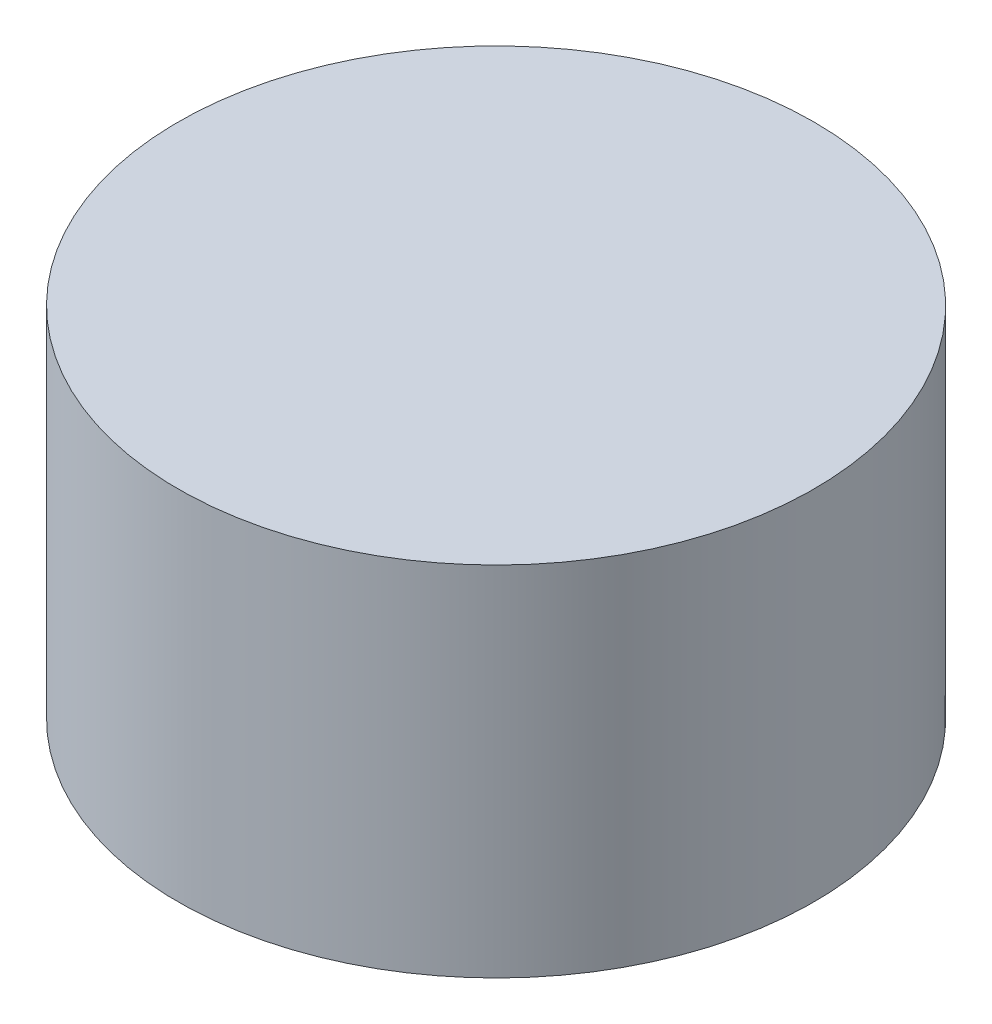
ISO-10303-21;
HEADER;
FILE_DESCRIPTION(('STEP AP214'),'2;1');
FILE_NAME('part.step','',(''),(''),'','','');
FILE_SCHEMA(('AUTOMOTIVE_DESIGN { 1 0 10303 214 1 1 1 1 }'));
ENDSEC;
DATA;
#1=APPLICATION_CONTEXT('core data for automotive mechanical design processes');
#2=APPLICATION_PROTOCOL_DEFINITION('international standard','automotive_design',2000,#1);
#3=PRODUCT_CONTEXT('',#1,'mechanical');
#4=PRODUCT('Part','Part','',(#3));
#5=PRODUCT_RELATED_PRODUCT_CATEGORY('part','',(#4));
#6=PRODUCT_DEFINITION_FORMATION('','',#4);
#7=PRODUCT_DEFINITION_CONTEXT('part definition',#1,'design');
#8=PRODUCT_DEFINITION('design','',#6,#7);
#9=PRODUCT_DEFINITION_SHAPE('','',#8);
#10=(LENGTH_UNIT() NAMED_UNIT(*) SI_UNIT(.MILLI.,.METRE.));
#11=(NAMED_UNIT(*) PLANE_ANGLE_UNIT() SI_UNIT($,.RADIAN.));
#12=(NAMED_UNIT(*) SI_UNIT($,.STERADIAN.) SOLID_ANGLE_UNIT());
#13=UNCERTAINTY_MEASURE_WITH_UNIT(LENGTH_MEASURE(1.E-05),#10,'distance_accuracy_value','');
#14=(GEOMETRIC_REPRESENTATION_CONTEXT(3) GLOBAL_UNCERTAINTY_ASSIGNED_CONTEXT((#13)) GLOBAL_UNIT_ASSIGNED_CONTEXT((#10,
#11,#12)) REPRESENTATION_CONTEXT('',''));
#15=CARTESIAN_POINT('',(0.,0.,0.));
#16=DIRECTION('',(0.,0.,1.));
#17=DIRECTION('',(1.,0.,0.));
#18=AXIS2_PLACEMENT_3D('',#15,#16,#17);
#19=CARTESIAN_POINT('',(0.,45.,0.));
#20=DIRECTION('',(0.,1.,0.));
#21=DIRECTION('',(0.,0.,1.));
#22=AXIS2_PLACEMENT_3D('',#19,#20,#21);
#23=PLANE('',#22);
#24=CARTESIAN_POINT('',(0.,45.,0.));
#25=DIRECTION('',(0.,-1.,0.));
#26=DIRECTION('',(0.,0.,-1.));
#27=AXIS2_PLACEMENT_3D('',#24,#25,#26);
#28=CIRCLE('',#27,40.);
#29=CARTESIAN_POINT('',(0.,45.,-40.));
#30=VERTEX_POINT('',#29);
#31=EDGE_CURVE('E18',#30,#30,#28,.T.);
#32=ORIENTED_EDGE('',*,*,#31,.F.);
#33=EDGE_LOOP('',(#32));
#34=FACE_BOUND('',#33,.T.);
#35=ADVANCED_FACE('F15',(#34),#23,.T.);
#36=CARTESIAN_POINT('',(0.,0.,0.));
#37=DIRECTION('',(0.,1.,0.));
#38=DIRECTION('',(0.,0.,1.));
#39=AXIS2_PLACEMENT_3D('',#36,#37,#38);
#40=PLANE('',#39);
#41=CARTESIAN_POINT('',(0.,0.,0.));
#42=DIRECTION('',(0.,-1.,0.));
#43=DIRECTION('',(0.,0.,-1.));
#44=AXIS2_PLACEMENT_3D('',#41,#42,#43);
#45=CIRCLE('',#44,40.);
#46=CARTESIAN_POINT('',(0.,0.,-40.));
#47=VERTEX_POINT('',#46);
#48=EDGE_CURVE('E10',#47,#47,#45,.F.);
#49=ORIENTED_EDGE('',*,*,#48,.F.);
#50=EDGE_LOOP('',(#49));
#51=FACE_BOUND('',#50,.T.);
#52=ADVANCED_FACE('F30',(#51),#40,.F.);
#53=CARTESIAN_POINT('',(0.,45.,0.));
#54=DIRECTION('',(0.,-1.,0.));
#55=DIRECTION('',(0.,0.,-1.));
#56=AXIS2_PLACEMENT_3D('',#53,#54,#55);
#57=CYLINDRICAL_SURFACE('',#56,40.);
#58=ORIENTED_EDGE('',*,*,#31,.T.);
#59=EDGE_LOOP('',(#58));
#60=FACE_BOUND('',#59,.T.);
#61=ORIENTED_EDGE('',*,*,#48,.T.);
#62=EDGE_LOOP('',(#61));
#63=FACE_BOUND('',#62,.T.);
#64=ADVANCED_FACE('F27',(#60,#63),#57,.T.);
#65=CLOSED_SHELL('',(#35,#52,#64));
#66=MANIFOLD_SOLID_BREP('B1',#65);
#67=ADVANCED_BREP_SHAPE_REPRESENTATION('',(#18,#66),#14);
#68=SHAPE_DEFINITION_REPRESENTATION(#9,#67);
ENDSEC;
END-ISO-10303-21;
